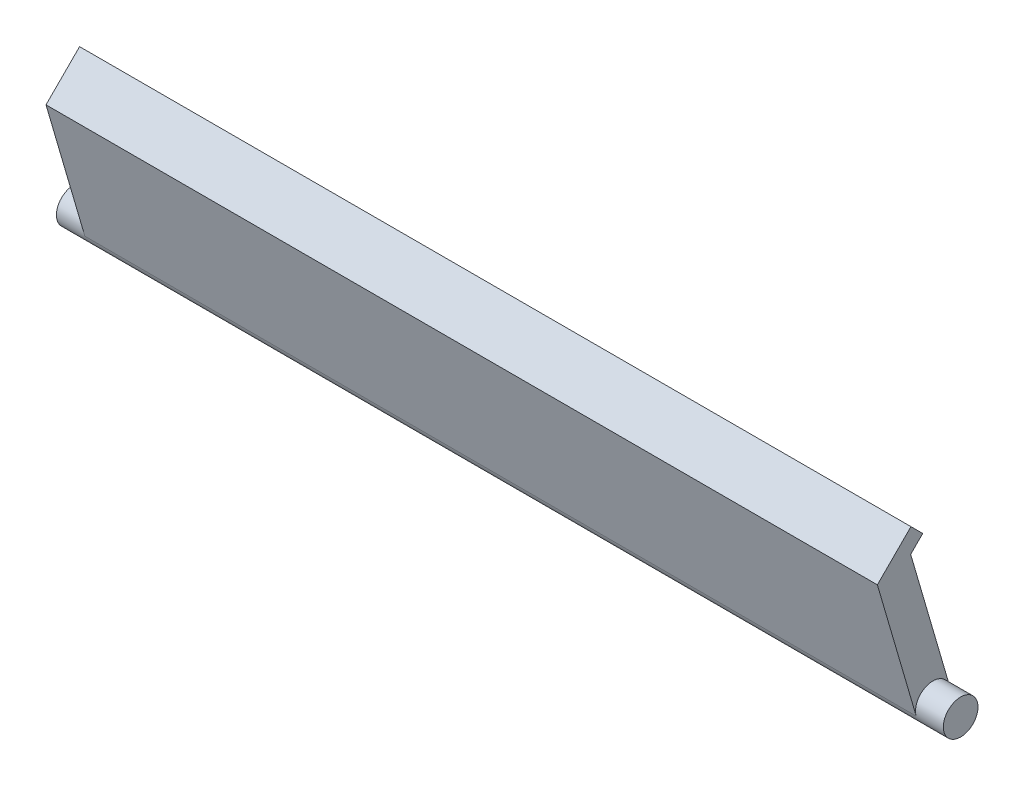
ISO-10303-21;
HEADER;
FILE_DESCRIPTION(('STEP AP214'),'2;1');
FILE_NAME('part.step','',(''),(''),'','','');
FILE_SCHEMA(('AUTOMOTIVE_DESIGN { 1 0 10303 214 1 1 1 1 }'));
ENDSEC;
DATA;
#1=APPLICATION_CONTEXT('core data for automotive mechanical design processes');
#2=APPLICATION_PROTOCOL_DEFINITION('international standard','automotive_design',2000,#1);
#3=PRODUCT_CONTEXT('',#1,'mechanical');
#4=PRODUCT('Part','Part','',(#3));
#5=PRODUCT_RELATED_PRODUCT_CATEGORY('part','',(#4));
#6=PRODUCT_DEFINITION_FORMATION('','',#4);
#7=PRODUCT_DEFINITION_CONTEXT('part definition',#1,'design');
#8=PRODUCT_DEFINITION('design','',#6,#7);
#9=PRODUCT_DEFINITION_SHAPE('','',#8);
#10=(LENGTH_UNIT() NAMED_UNIT(*) SI_UNIT(.MILLI.,.METRE.));
#11=(NAMED_UNIT(*) PLANE_ANGLE_UNIT() SI_UNIT($,.RADIAN.));
#12=(NAMED_UNIT(*) SI_UNIT($,.STERADIAN.) SOLID_ANGLE_UNIT());
#13=UNCERTAINTY_MEASURE_WITH_UNIT(LENGTH_MEASURE(1.E-05),#10,'distance_accuracy_value','');
#14=(GEOMETRIC_REPRESENTATION_CONTEXT(3) GLOBAL_UNCERTAINTY_ASSIGNED_CONTEXT((#13)) GLOBAL_UNIT_ASSIGNED_CONTEXT((#10,
#11,#12)) REPRESENTATION_CONTEXT('',''));
#15=CARTESIAN_POINT('',(0.,0.,0.));
#16=DIRECTION('',(0.,0.,1.));
#17=DIRECTION('',(1.,0.,0.));
#18=AXIS2_PLACEMENT_3D('',#15,#16,#17);
#19=CARTESIAN_POINT('',(1200.,0.,0.));
#20=DIRECTION('',(-1.,0.,0.));
#21=DIRECTION('',(0.,0.,1.));
#22=AXIS2_PLACEMENT_3D('',#19,#20,#21);
#23=CYLINDRICAL_SURFACE('',#22,25.);
#24=DIRECTION('',(1.,0.,0.));
#25=VECTOR('',#24,1.);
#26=CARTESIAN_POINT('',(2.00000000000111,7.00126311809391,-23.9996315544889));
#27=LINE('',#26,#25);
#28=CARTESIAN_POINT('',(2.00000000000111,7.00126311809391,-23.9996315544889));
#29=VERTEX_POINT('',#28);
#30=CARTESIAN_POINT('',(1200.,7.00126311809386,-23.9996315544887));
#31=VERTEX_POINT('',#30);
#32=EDGE_CURVE('E115',#29,#31,#27,.T.);
#33=ORIENTED_EDGE('',*,*,#32,.T.);
#34=CARTESIAN_POINT('',(1200.,0.,0.));
#35=DIRECTION('',(1.,0.,0.));
#36=DIRECTION('',(0.,0.,-1.));
#37=AXIS2_PLACEMENT_3D('',#34,#35,#36);
#38=CIRCLE('',#37,24.9999999999997);
#39=CARTESIAN_POINT('',(1200.,-7.00126311809391,23.9996315544889));
#40=VERTEX_POINT('',#39);
#41=EDGE_CURVE('E139',#31,#40,#38,.T.);
#42=ORIENTED_EDGE('',*,*,#41,.T.);
#43=DIRECTION('',(1.,0.,0.));
#44=VECTOR('',#43,1.);
#45=CARTESIAN_POINT('',(2.00000000000111,-7.00126311809391,23.9996315544889));
#46=LINE('',#45,#44);
#47=CARTESIAN_POINT('',(2.00000000000111,-7.00126311809391,23.9996315544889));
#48=VERTEX_POINT('',#47);
#49=EDGE_CURVE('E122',#48,#40,#46,.T.);
#50=ORIENTED_EDGE('',*,*,#49,.F.);
#51=CARTESIAN_POINT('',(2.00000000000111,0.,0.));
#52=DIRECTION('',(1.,0.,0.));
#53=DIRECTION('',(0.,0.,-1.));
#54=AXIS2_PLACEMENT_3D('',#51,#52,#53);
#55=CIRCLE('',#54,25.);
#56=EDGE_CURVE('E107',#29,#48,#55,.T.);
#57=ORIENTED_EDGE('',*,*,#56,.F.);
#58=EDGE_LOOP('',(#33,#42,#50,#57));
#59=FACE_BOUND('',#58,.T.);
#60=CARTESIAN_POINT('',(-37.9999999999989,0.,0.));
#61=DIRECTION('',(1.,0.,0.));
#62=DIRECTION('',(0.,0.,-1.));
#63=AXIS2_PLACEMENT_3D('',#60,#61,#62);
#64=CIRCLE('',#63,24.9999999999997);
#65=CARTESIAN_POINT('',(-37.9999999999989,0.,-24.9999999999997));
#66=VERTEX_POINT('',#65);
#67=EDGE_CURVE('E188',#66,#66,#64,.T.);
#68=ORIENTED_EDGE('',*,*,#67,.T.);
#69=EDGE_LOOP('',(#68));
#70=FACE_BOUND('',#69,.T.);
#71=CARTESIAN_POINT('',(1240.,0.,0.));
#72=DIRECTION('',(1.,0.,0.));
#73=DIRECTION('',(0.,0.,-1.));
#74=AXIS2_PLACEMENT_3D('',#71,#72,#73);
#75=CIRCLE('',#74,24.9999999999997);
#76=CARTESIAN_POINT('',(1240.,0.,-24.9999999999997));
#77=VERTEX_POINT('',#76);
#78=EDGE_CURVE('E192',#77,#77,#75,.T.);
#79=ORIENTED_EDGE('',*,*,#78,.F.);
#80=EDGE_LOOP('',(#79));
#81=FACE_BOUND('',#80,.T.);
#82=ADVANCED_FACE('F41',(#59,#70,#81),#23,.T.);
#83=CARTESIAN_POINT('',(1200.,0.,0.));
#84=DIRECTION('',(1.,0.,0.));
#85=DIRECTION('',(0.,0.,-1.));
#86=AXIS2_PLACEMENT_3D('',#83,#84,#85);
#87=PLANE('',#86);
#88=ORIENTED_EDGE('',*,*,#41,.F.);
#89=DIRECTION('',(0.,-0.959985262179555,-0.280050524723756));
#90=VECTOR('',#89,1.);
#91=CARTESIAN_POINT('',(1200.,7.00126311809391,-23.9996315544889));
#92=LINE('',#91,#90);
#93=CARTESIAN_POINT('',(1200.,198.998315554005,32.0104733902624));
#94=VERTEX_POINT('',#93);
#95=EDGE_CURVE('E118',#94,#31,#92,.T.);
#96=ORIENTED_EDGE('',*,*,#95,.F.);
#97=DIRECTION('',(0.,0.707106781186549,-0.707106781186547));
#98=VECTOR('',#97,1.);
#99=CARTESIAN_POINT('',(1200.,115.504394472133,115.504394472134));
#100=LINE('',#99,#98);
#101=CARTESIAN_POINT('',(1200.,216.390678549281,14.6181103949863));
#102=VERTEX_POINT('',#101);
#103=EDGE_CURVE('E146',#94,#102,#100,.T.);
#104=ORIENTED_EDGE('',*,*,#103,.T.);
#105=DIRECTION('',(0.,-0.707106781186547,-0.707106781186549));
#106=VECTOR('',#105,1.);
#107=CARTESIAN_POINT('',(1200.,100.886284077148,-100.886284077147));
#108=LINE('',#107,#106);
#109=CARTESIAN_POINT('',(1200.,233.389046985676,31.6164788313814));
#110=VERTEX_POINT('',#109);
#111=EDGE_CURVE('E135',#110,#102,#108,.T.);
#112=ORIENTED_EDGE('',*,*,#111,.F.);
#113=DIRECTION('',(0.,0.707106781186549,-0.707106781186546));
#114=VECTOR('',#113,1.);
#115=CARTESIAN_POINT('',(1200.,132.502762908528,132.502762908529));
#116=LINE('',#115,#114);
#117=CARTESIAN_POINT('',(1200.,184.995789317817,80.0097364992402));
#118=VERTEX_POINT('',#117);
#119=EDGE_CURVE('E138',#118,#110,#116,.T.);
#120=ORIENTED_EDGE('',*,*,#119,.F.);
#121=DIRECTION('',(0.,-0.959985262179555,-0.280050524723756));
#122=VECTOR('',#121,1.);
#123=CARTESIAN_POINT('',(1200.,-7.00126311809391,23.9996315544889));
#124=LINE('',#123,#122);
#125=EDGE_CURVE('E58',#118,#40,#124,.T.);
#126=ORIENTED_EDGE('',*,*,#125,.T.);
#127=EDGE_LOOP('',(#88,#96,#104,#112,#120,#126));
#128=FACE_BOUND('',#127,.T.);
#129=ADVANCED_FACE('F161',(#128),#87,.T.);
#130=CARTESIAN_POINT('',(2.00000000000111,100.886284077148,-100.886284077147));
#131=DIRECTION('',(0.,-0.707106781186548,0.707106781186547));
#132=DIRECTION('',(0.,-0.707106781186547,-0.707106781186548));
#133=AXIS2_PLACEMENT_3D('',#130,#131,#132);
#134=PLANE('',#133);
#135=ORIENTED_EDGE('',*,*,#111,.T.);
#136=DIRECTION('',(1.,0.,0.));
#137=VECTOR('',#136,1.);
#138=CARTESIAN_POINT('',(2.00000000000111,216.390678549281,14.6181103949863));
#139=LINE('',#138,#137);
#140=CARTESIAN_POINT('',(2.00000000000111,216.390678549281,14.6181103949863));
#141=VERTEX_POINT('',#140);
#142=EDGE_CURVE('E11',#141,#102,#139,.T.);
#143=ORIENTED_EDGE('',*,*,#142,.F.);
#144=DIRECTION('',(0.,-0.707106781186547,-0.707106781186549));
#145=VECTOR('',#144,1.);
#146=CARTESIAN_POINT('',(2.00000000000111,100.886284077148,-100.886284077147));
#147=LINE('',#146,#145);
#148=CARTESIAN_POINT('',(2.00000000000111,233.389046985676,31.6164788313814));
#149=VERTEX_POINT('',#148);
#150=EDGE_CURVE('E67',#149,#141,#147,.T.);
#151=ORIENTED_EDGE('',*,*,#150,.F.);
#152=DIRECTION('',(1.,0.,0.));
#153=VECTOR('',#152,1.);
#154=CARTESIAN_POINT('',(2.00000000000111,233.389046985676,31.6164788313814));
#155=LINE('',#154,#153);
#156=EDGE_CURVE('E44',#149,#110,#155,.T.);
#157=ORIENTED_EDGE('',*,*,#156,.T.);
#158=EDGE_LOOP('',(#135,#143,#151,#157));
#159=FACE_BOUND('',#158,.T.);
#160=ADVANCED_FACE('F160',(#159),#134,.F.);
#161=CARTESIAN_POINT('',(2.00000000000111,115.504394472133,115.504394472134));
#162=DIRECTION('',(0.,-0.707106781186547,-0.707106781186548));
#163=DIRECTION('',(0.,0.707106781186548,-0.707106781186547));
#164=AXIS2_PLACEMENT_3D('',#161,#162,#163);
#165=PLANE('',#164);
#166=ORIENTED_EDGE('',*,*,#103,.F.);
#167=DIRECTION('',(1.,0.,0.));
#168=VECTOR('',#167,1.);
#169=CARTESIAN_POINT('',(2.00000000000111,198.998315554005,32.0104733902624));
#170=LINE('',#169,#168);
#171=CARTESIAN_POINT('',(2.00000000000111,198.998315554005,32.0104733902624));
#172=VERTEX_POINT('',#171);
#173=EDGE_CURVE('E50',#172,#94,#170,.T.);
#174=ORIENTED_EDGE('',*,*,#173,.F.);
#175=DIRECTION('',(0.,0.707106781186549,-0.707106781186547));
#176=VECTOR('',#175,1.);
#177=CARTESIAN_POINT('',(2.00000000000111,115.504394472133,115.504394472134));
#178=LINE('',#177,#176);
#179=EDGE_CURVE('E109',#172,#141,#178,.T.);
#180=ORIENTED_EDGE('',*,*,#179,.T.);
#181=ORIENTED_EDGE('',*,*,#142,.T.);
#182=EDGE_LOOP('',(#166,#174,#180,#181));
#183=FACE_BOUND('',#182,.T.);
#184=ADVANCED_FACE('F162',(#183),#165,.T.);
#185=CARTESIAN_POINT('',(2.00000000000111,7.00126311809391,-23.9996315544889));
#186=DIRECTION('',(0.,-0.280050524723756,0.959985262179555));
#187=DIRECTION('',(0.,-0.959985262179555,-0.280050524723756));
#188=AXIS2_PLACEMENT_3D('',#185,#186,#187);
#189=PLANE('',#188);
#190=ORIENTED_EDGE('',*,*,#95,.T.);
#191=ORIENTED_EDGE('',*,*,#32,.F.);
#192=DIRECTION('',(0.,-0.959985262179555,-0.280050524723756));
#193=VECTOR('',#192,1.);
#194=CARTESIAN_POINT('',(2.00000000000111,7.00126311809391,-23.9996315544889));
#195=LINE('',#194,#193);
#196=EDGE_CURVE('E103',#172,#29,#195,.T.);
#197=ORIENTED_EDGE('',*,*,#196,.F.);
#198=ORIENTED_EDGE('',*,*,#173,.T.);
#199=EDGE_LOOP('',(#190,#191,#197,#198));
#200=FACE_BOUND('',#199,.T.);
#201=ADVANCED_FACE('F116',(#200),#189,.F.);
#202=CARTESIAN_POINT('',(2.00000000000111,-7.00126311809391,23.9996315544889));
#203=DIRECTION('',(0.,-0.280050524723756,0.959985262179555));
#204=DIRECTION('',(0.,-0.959985262179555,-0.280050524723756));
#205=AXIS2_PLACEMENT_3D('',#202,#203,#204);
#206=PLANE('',#205);
#207=ORIENTED_EDGE('',*,*,#125,.F.);
#208=DIRECTION('',(1.,0.,0.));
#209=VECTOR('',#208,1.);
#210=CARTESIAN_POINT('',(2.00000000000111,184.995789317817,80.0097364992402));
#211=LINE('',#210,#209);
#212=CARTESIAN_POINT('',(2.00000000000111,184.995789317817,80.0097364992402));
#213=VERTEX_POINT('',#212);
#214=EDGE_CURVE('E153',#213,#118,#211,.T.);
#215=ORIENTED_EDGE('',*,*,#214,.F.);
#216=DIRECTION('',(0.,-0.959985262179555,-0.280050524723756));
#217=VECTOR('',#216,1.);
#218=CARTESIAN_POINT('',(2.00000000000111,-7.00126311809391,23.9996315544889));
#219=LINE('',#218,#217);
#220=EDGE_CURVE('E127',#213,#48,#219,.T.);
#221=ORIENTED_EDGE('',*,*,#220,.T.);
#222=ORIENTED_EDGE('',*,*,#49,.T.);
#223=EDGE_LOOP('',(#207,#215,#221,#222));
#224=FACE_BOUND('',#223,.T.);
#225=ADVANCED_FACE('F169',(#224),#206,.T.);
#226=CARTESIAN_POINT('',(2.00000000000111,132.502762908528,132.502762908529));
#227=DIRECTION('',(0.,-0.707106781186546,-0.707106781186549));
#228=DIRECTION('',(0.,0.707106781186549,-0.707106781186546));
#229=AXIS2_PLACEMENT_3D('',#226,#227,#228);
#230=PLANE('',#229);
#231=ORIENTED_EDGE('',*,*,#119,.T.);
#232=ORIENTED_EDGE('',*,*,#156,.F.);
#233=DIRECTION('',(0.,0.707106781186549,-0.707106781186546));
#234=VECTOR('',#233,1.);
#235=CARTESIAN_POINT('',(2.00000000000111,132.502762908528,132.502762908529));
#236=LINE('',#235,#234);
#237=EDGE_CURVE('E93',#213,#149,#236,.T.);
#238=ORIENTED_EDGE('',*,*,#237,.F.);
#239=ORIENTED_EDGE('',*,*,#214,.T.);
#240=EDGE_LOOP('',(#231,#232,#238,#239));
#241=FACE_BOUND('',#240,.T.);
#242=ADVANCED_FACE('F180',(#241),#230,.F.);
#243=CARTESIAN_POINT('',(2.00000000000111,0.,0.));
#244=DIRECTION('',(1.,0.,0.));
#245=DIRECTION('',(0.,0.,-1.));
#246=AXIS2_PLACEMENT_3D('',#243,#244,#245);
#247=PLANE('',#246);
#248=ORIENTED_EDGE('',*,*,#150,.T.);
#249=ORIENTED_EDGE('',*,*,#179,.F.);
#250=ORIENTED_EDGE('',*,*,#196,.T.);
#251=ORIENTED_EDGE('',*,*,#56,.T.);
#252=ORIENTED_EDGE('',*,*,#220,.F.);
#253=ORIENTED_EDGE('',*,*,#237,.T.);
#254=EDGE_LOOP('',(#248,#249,#250,#251,#252,#253));
#255=FACE_BOUND('',#254,.T.);
#256=ADVANCED_FACE('F105',(#255),#247,.F.);
#257=CARTESIAN_POINT('',(-37.9999999999989,0.,0.));
#258=DIRECTION('',(1.,0.,0.));
#259=DIRECTION('',(0.,0.,-1.));
#260=AXIS2_PLACEMENT_3D('',#257,#258,#259);
#261=PLANE('',#260);
#262=ORIENTED_EDGE('',*,*,#67,.F.);
#263=EDGE_LOOP('',(#262));
#264=FACE_BOUND('',#263,.T.);
#265=ADVANCED_FACE('F205',(#264),#261,.F.);
#266=CARTESIAN_POINT('',(1240.,0.,0.));
#267=DIRECTION('',(1.,0.,0.));
#268=DIRECTION('',(0.,0.,-1.));
#269=AXIS2_PLACEMENT_3D('',#266,#267,#268);
#270=PLANE('',#269);
#271=ORIENTED_EDGE('',*,*,#78,.T.);
#272=EDGE_LOOP('',(#271));
#273=FACE_BOUND('',#272,.T.);
#274=ADVANCED_FACE('F202',(#273),#270,.T.);
#275=CLOSED_SHELL('',(#82,#129,#160,#184,#201,#225,#242,#256,#265,#274));
#276=MANIFOLD_SOLID_BREP('B2',#275);
#277=ADVANCED_BREP_SHAPE_REPRESENTATION('',(#18,#276),#14);
#278=SHAPE_DEFINITION_REPRESENTATION(#9,#277);
ENDSEC;
END-ISO-10303-21;
